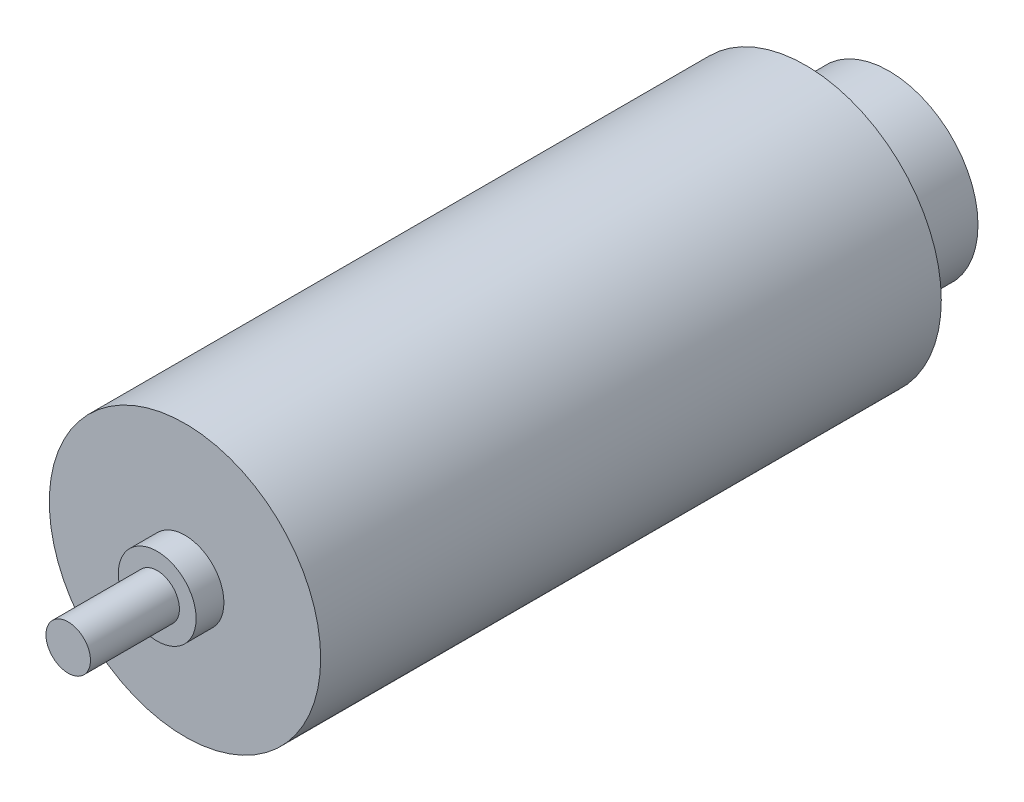
ISO-10303-21;
HEADER;
FILE_DESCRIPTION(('STEP AP214'),'2;1');
FILE_NAME('part.step','',(''),(''),'','','');
FILE_SCHEMA(('AUTOMOTIVE_DESIGN { 1 0 10303 214 1 1 1 1 }'));
ENDSEC;
DATA;
#1=APPLICATION_CONTEXT('core data for automotive mechanical design processes');
#2=APPLICATION_PROTOCOL_DEFINITION('international standard','automotive_design',2000,#1);
#3=PRODUCT_CONTEXT('',#1,'mechanical');
#4=PRODUCT('Part','Part','',(#3));
#5=PRODUCT_RELATED_PRODUCT_CATEGORY('part','',(#4));
#6=PRODUCT_DEFINITION_FORMATION('','',#4);
#7=PRODUCT_DEFINITION_CONTEXT('part definition',#1,'design');
#8=PRODUCT_DEFINITION('design','',#6,#7);
#9=PRODUCT_DEFINITION_SHAPE('','',#8);
#10=(LENGTH_UNIT() NAMED_UNIT(*) SI_UNIT(.MILLI.,.METRE.));
#11=(NAMED_UNIT(*) PLANE_ANGLE_UNIT() SI_UNIT($,.RADIAN.));
#12=(NAMED_UNIT(*) SI_UNIT($,.STERADIAN.) SOLID_ANGLE_UNIT());
#13=UNCERTAINTY_MEASURE_WITH_UNIT(LENGTH_MEASURE(1.E-05),#10,'distance_accuracy_value','');
#14=(GEOMETRIC_REPRESENTATION_CONTEXT(3) GLOBAL_UNCERTAINTY_ASSIGNED_CONTEXT((#13)) GLOBAL_UNIT_ASSIGNED_CONTEXT((#10,
#11,#12)) REPRESENTATION_CONTEXT('',''));
#15=CARTESIAN_POINT('',(0.,0.,0.));
#16=DIRECTION('',(0.,0.,1.));
#17=DIRECTION('',(1.,0.,0.));
#18=AXIS2_PLACEMENT_3D('',#15,#16,#17);
#19=CARTESIAN_POINT('',(0.,0.,55.8));
#20=DIRECTION('',(0.,0.,-1.));
#21=DIRECTION('',(-1.,0.,0.));
#22=AXIS2_PLACEMENT_3D('',#19,#20,#21);
#23=CYLINDRICAL_SURFACE('',#22,12.2);
#24=CARTESIAN_POINT('',(0.,0.,55.8));
#25=DIRECTION('',(0.,0.,1.));
#26=DIRECTION('',(1.,0.,0.));
#27=AXIS2_PLACEMENT_3D('',#24,#25,#26);
#28=CIRCLE('',#27,12.2);
#29=CARTESIAN_POINT('',(12.2,0.,55.8));
#30=VERTEX_POINT('',#29);
#31=EDGE_CURVE('E48',#30,#30,#28,.T.);
#32=ORIENTED_EDGE('',*,*,#31,.F.);
#33=EDGE_LOOP('',(#32));
#34=FACE_BOUND('',#33,.T.);
#35=CARTESIAN_POINT('',(0.,0.,0.));
#36=DIRECTION('',(0.,0.,1.));
#37=DIRECTION('',(1.,0.,0.));
#38=AXIS2_PLACEMENT_3D('',#35,#36,#37);
#39=CIRCLE('',#38,12.2);
#40=CARTESIAN_POINT('',(12.2,0.,0.));
#41=VERTEX_POINT('',#40);
#42=EDGE_CURVE('E52',#41,#41,#39,.T.);
#43=ORIENTED_EDGE('',*,*,#42,.T.);
#44=EDGE_LOOP('',(#43));
#45=FACE_BOUND('',#44,.T.);
#46=ADVANCED_FACE('F42',(#34,#45),#23,.T.);
#47=CARTESIAN_POINT('',(0.,0.,55.8));
#48=DIRECTION('',(0.,0.,1.));
#49=DIRECTION('',(1.,0.,0.));
#50=AXIS2_PLACEMENT_3D('',#47,#48,#49);
#51=PLANE('',#50);
#52=CARTESIAN_POINT('',(0.,0.,55.8));
#53=DIRECTION('',(0.,0.,1.));
#54=DIRECTION('',(1.,0.,0.));
#55=AXIS2_PLACEMENT_3D('',#52,#53,#54);
#56=CIRCLE('',#55,3.5);
#57=CARTESIAN_POINT('',(3.5,0.,55.8));
#58=VERTEX_POINT('',#57);
#59=EDGE_CURVE('E62',#58,#58,#56,.T.);
#60=ORIENTED_EDGE('',*,*,#59,.F.);
#61=EDGE_LOOP('',(#60));
#62=FACE_BOUND('',#61,.T.);
#63=ORIENTED_EDGE('',*,*,#31,.T.);
#64=EDGE_LOOP('',(#63));
#65=FACE_BOUND('',#64,.T.);
#66=ADVANCED_FACE('F95',(#62,#65),#51,.T.);
#67=CARTESIAN_POINT('',(0.,0.,0.));
#68=DIRECTION('',(0.,0.,1.));
#69=DIRECTION('',(1.,0.,0.));
#70=AXIS2_PLACEMENT_3D('',#67,#68,#69);
#71=PLANE('',#70);
#72=CARTESIAN_POINT('',(0.,0.,0.));
#73=DIRECTION('',(0.,0.,1.));
#74=DIRECTION('',(1.,0.,0.));
#75=AXIS2_PLACEMENT_3D('',#72,#73,#74);
#76=CIRCLE('',#75,8.);
#77=CARTESIAN_POINT('',(8.,0.,0.));
#78=VERTEX_POINT('',#77);
#79=EDGE_CURVE('E12',#78,#78,#76,.F.);
#80=ORIENTED_EDGE('',*,*,#79,.F.);
#81=EDGE_LOOP('',(#80));
#82=FACE_BOUND('',#81,.T.);
#83=ORIENTED_EDGE('',*,*,#42,.F.);
#84=EDGE_LOOP('',(#83));
#85=FACE_BOUND('',#84,.T.);
#86=ADVANCED_FACE('F97',(#82,#85),#71,.F.);
#87=CARTESIAN_POINT('',(0.,0.,-7.5));
#88=DIRECTION('',(0.,0.,1.));
#89=DIRECTION('',(1.,0.,0.));
#90=AXIS2_PLACEMENT_3D('',#87,#88,#89);
#91=CYLINDRICAL_SURFACE('',#90,8.);
#92=CARTESIAN_POINT('',(0.,0.,-7.5));
#93=DIRECTION('',(0.,0.,-1.));
#94=DIRECTION('',(-1.,0.,0.));
#95=AXIS2_PLACEMENT_3D('',#92,#93,#94);
#96=CIRCLE('',#95,8.);
#97=CARTESIAN_POINT('',(-8.,0.,-7.5));
#98=VERTEX_POINT('',#97);
#99=EDGE_CURVE('E57',#98,#98,#96,.T.);
#100=ORIENTED_EDGE('',*,*,#99,.F.);
#101=EDGE_LOOP('',(#100));
#102=FACE_BOUND('',#101,.T.);
#103=ORIENTED_EDGE('',*,*,#79,.T.);
#104=EDGE_LOOP('',(#103));
#105=FACE_BOUND('',#104,.T.);
#106=ADVANCED_FACE('F103',(#102,#105),#91,.T.);
#107=CARTESIAN_POINT('',(0.,0.,-7.5));
#108=DIRECTION('',(0.,0.,-1.));
#109=DIRECTION('',(-1.,0.,0.));
#110=AXIS2_PLACEMENT_3D('',#107,#108,#109);
#111=PLANE('',#110);
#112=ORIENTED_EDGE('',*,*,#99,.T.);
#113=EDGE_LOOP('',(#112));
#114=FACE_BOUND('',#113,.T.);
#115=ADVANCED_FACE('F91',(#114),#111,.T.);
#116=CARTESIAN_POINT('',(0.,0.,58.3));
#117=DIRECTION('',(0.,0.,-1.));
#118=DIRECTION('',(-1.,0.,0.));
#119=AXIS2_PLACEMENT_3D('',#116,#117,#118);
#120=CYLINDRICAL_SURFACE('',#119,3.5);
#121=CARTESIAN_POINT('',(0.,0.,58.3));
#122=DIRECTION('',(0.,0.,1.));
#123=DIRECTION('',(1.,0.,0.));
#124=AXIS2_PLACEMENT_3D('',#121,#122,#123);
#125=CIRCLE('',#124,3.5);
#126=CARTESIAN_POINT('',(3.5,0.,58.3));
#127=VERTEX_POINT('',#126);
#128=EDGE_CURVE('E61',#127,#127,#125,.T.);
#129=ORIENTED_EDGE('',*,*,#128,.F.);
#130=EDGE_LOOP('',(#129));
#131=FACE_BOUND('',#130,.T.);
#132=ORIENTED_EDGE('',*,*,#59,.T.);
#133=EDGE_LOOP('',(#132));
#134=FACE_BOUND('',#133,.T.);
#135=ADVANCED_FACE('F85',(#131,#134),#120,.T.);
#136=CARTESIAN_POINT('',(0.,0.,58.3));
#137=DIRECTION('',(0.,0.,1.));
#138=DIRECTION('',(1.,0.,0.));
#139=AXIS2_PLACEMENT_3D('',#136,#137,#138);
#140=PLANE('',#139);
#141=CARTESIAN_POINT('',(0.,0.,58.3));
#142=DIRECTION('',(0.,0.,1.));
#143=DIRECTION('',(1.,0.,0.));
#144=AXIS2_PLACEMENT_3D('',#141,#142,#143);
#145=CIRCLE('',#144,2.);
#146=CARTESIAN_POINT('',(2.,0.,58.3));
#147=VERTEX_POINT('',#146);
#148=EDGE_CURVE('E68',#147,#147,#145,.T.);
#149=ORIENTED_EDGE('',*,*,#148,.F.);
#150=EDGE_LOOP('',(#149));
#151=FACE_BOUND('',#150,.T.);
#152=ORIENTED_EDGE('',*,*,#128,.T.);
#153=EDGE_LOOP('',(#152));
#154=FACE_BOUND('',#153,.T.);
#155=ADVANCED_FACE('F79',(#151,#154),#140,.T.);
#156=CARTESIAN_POINT('',(0.,0.,66.3));
#157=DIRECTION('',(0.,0.,-1.));
#158=DIRECTION('',(-1.,0.,0.));
#159=AXIS2_PLACEMENT_3D('',#156,#157,#158);
#160=CYLINDRICAL_SURFACE('',#159,2.);
#161=CARTESIAN_POINT('',(0.,0.,66.3));
#162=DIRECTION('',(0.,0.,1.));
#163=DIRECTION('',(1.,0.,0.));
#164=AXIS2_PLACEMENT_3D('',#161,#162,#163);
#165=CIRCLE('',#164,2.);
#166=CARTESIAN_POINT('',(2.,0.,66.3));
#167=VERTEX_POINT('',#166);
#168=EDGE_CURVE('E65',#167,#167,#165,.T.);
#169=ORIENTED_EDGE('',*,*,#168,.F.);
#170=EDGE_LOOP('',(#169));
#171=FACE_BOUND('',#170,.T.);
#172=ORIENTED_EDGE('',*,*,#148,.T.);
#173=EDGE_LOOP('',(#172));
#174=FACE_BOUND('',#173,.T.);
#175=ADVANCED_FACE('F76',(#171,#174),#160,.T.);
#176=CARTESIAN_POINT('',(0.,0.,66.3));
#177=DIRECTION('',(0.,0.,1.));
#178=DIRECTION('',(1.,0.,0.));
#179=AXIS2_PLACEMENT_3D('',#176,#177,#178);
#180=PLANE('',#179);
#181=ORIENTED_EDGE('',*,*,#168,.T.);
#182=EDGE_LOOP('',(#181));
#183=FACE_BOUND('',#182,.T.);
#184=ADVANCED_FACE('F74',(#183),#180,.T.);
#185=CLOSED_SHELL('',(#46,#66,#86,#106,#115,#135,#155,#175,#184));
#186=MANIFOLD_SOLID_BREP('B2',#185);
#187=ADVANCED_BREP_SHAPE_REPRESENTATION('',(#18,#186),#14);
#188=SHAPE_DEFINITION_REPRESENTATION(#9,#187);
ENDSEC;
END-ISO-10303-21;
